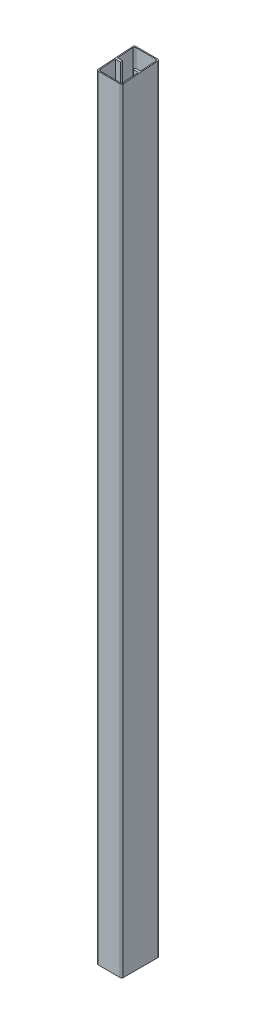
ISO-10303-21;
HEADER;
FILE_DESCRIPTION(('STEP AP214'),'2;1');
FILE_NAME('part.step','',(''),(''),'','','');
FILE_SCHEMA(('AUTOMOTIVE_DESIGN { 1 0 10303 214 1 1 1 1 }'));
ENDSEC;
DATA;
#1=APPLICATION_CONTEXT('core data for automotive mechanical design processes');
#2=APPLICATION_PROTOCOL_DEFINITION('international standard','automotive_design',2000,#1);
#3=PRODUCT_CONTEXT('',#1,'mechanical');
#4=PRODUCT('Part','Part','',(#3));
#5=PRODUCT_RELATED_PRODUCT_CATEGORY('part','',(#4));
#6=PRODUCT_DEFINITION_FORMATION('','',#4);
#7=PRODUCT_DEFINITION_CONTEXT('part definition',#1,'design');
#8=PRODUCT_DEFINITION('design','',#6,#7);
#9=PRODUCT_DEFINITION_SHAPE('','',#8);
#10=(LENGTH_UNIT() NAMED_UNIT(*) SI_UNIT(.MILLI.,.METRE.));
#11=(NAMED_UNIT(*) PLANE_ANGLE_UNIT() SI_UNIT($,.RADIAN.));
#12=(NAMED_UNIT(*) SI_UNIT($,.STERADIAN.) SOLID_ANGLE_UNIT());
#13=UNCERTAINTY_MEASURE_WITH_UNIT(LENGTH_MEASURE(1.E-05),#10,'distance_accuracy_value','');
#14=(GEOMETRIC_REPRESENTATION_CONTEXT(3) GLOBAL_UNCERTAINTY_ASSIGNED_CONTEXT((#13)) GLOBAL_UNIT_ASSIGNED_CONTEXT((#10,
#11,#12)) REPRESENTATION_CONTEXT('',''));
#15=CARTESIAN_POINT('',(0.,0.,0.));
#16=DIRECTION('',(0.,0.,1.));
#17=DIRECTION('',(1.,0.,0.));
#18=AXIS2_PLACEMENT_3D('',#15,#16,#17);
#19=CARTESIAN_POINT('',(-50.,3267.99923956295,75.));
#20=DIRECTION('',(0.,0.,-1.));
#21=DIRECTION('',(-1.,0.,0.));
#22=AXIS2_PLACEMENT_3D('',#19,#20,#21);
#23=PLANE('',#22);
#24=DIRECTION('',(1.,0.,0.));
#25=VECTOR('',#24,1.);
#26=CARTESIAN_POINT('',(-50.,0.,75.));
#27=LINE('',#26,#25);
#28=CARTESIAN_POINT('',(-44.,0.,75.));
#29=VERTEX_POINT('',#28);
#30=CARTESIAN_POINT('',(44.,0.,75.));
#31=VERTEX_POINT('',#30);
#32=EDGE_CURVE('E212',#29,#31,#27,.T.);
#33=ORIENTED_EDGE('',*,*,#32,.T.);
#34=DIRECTION('',(0.,-1.,0.));
#35=VECTOR('',#34,1.);
#36=CARTESIAN_POINT('',(44.,3267.99923956295,75.));
#37=LINE('',#36,#35);
#38=CARTESIAN_POINT('',(44.,3082.23684210526,75.));
#39=VERTEX_POINT('',#38);
#40=EDGE_CURVE('E288',#31,#39,#37,.F.);
#41=ORIENTED_EDGE('',*,*,#40,.T.);
#42=DIRECTION('',(1.,0.,0.));
#43=VECTOR('',#42,1.);
#44=CARTESIAN_POINT('',(-50.,3082.23684210526,75.));
#45=LINE('',#44,#43);
#46=CARTESIAN_POINT('',(-44.,3082.23684210526,75.));
#47=VERTEX_POINT('',#46);
#48=EDGE_CURVE('E345',#47,#39,#45,.T.);
#49=ORIENTED_EDGE('',*,*,#48,.F.);
#50=DIRECTION('',(0.,-1.,0.));
#51=VECTOR('',#50,1.);
#52=CARTESIAN_POINT('',(-44.,3267.99923956295,75.));
#53=LINE('',#52,#51);
#54=EDGE_CURVE('E285',#47,#29,#53,.T.);
#55=ORIENTED_EDGE('',*,*,#54,.T.);
#56=EDGE_LOOP('',(#33,#41,#49,#55));
#57=FACE_BOUND('',#56,.T.);
#58=ADVANCED_FACE('F38',(#57),#23,.F.);
#59=CARTESIAN_POINT('',(-50.,3267.99923956295,-75.));
#60=DIRECTION('',(1.,0.,0.));
#61=DIRECTION('',(0.,0.,-1.));
#62=AXIS2_PLACEMENT_3D('',#59,#60,#61);
#63=PLANE('',#62);
#64=DIRECTION('',(0.,-0.0700032814807309,0.997546761100416));
#65=VECTOR('',#64,1.);
#66=CARTESIAN_POINT('',(-50.,3093.62189520153,-87.2370066218541));
#67=LINE('',#66,#65);
#68=CARTESIAN_POINT('',(-50.,3092.34210526316,-68.9999999999999));
#69=VERTEX_POINT('',#68);
#70=CARTESIAN_POINT('',(-50.,3082.65789473684,69.));
#71=VERTEX_POINT('',#70);
#72=EDGE_CURVE('E347',#69,#71,#67,.T.);
#73=ORIENTED_EDGE('',*,*,#72,.F.);
#74=DIRECTION('',(0.,-1.,0.));
#75=VECTOR('',#74,1.);
#76=CARTESIAN_POINT('',(-50.,3267.99923956295,-69.));
#77=LINE('',#76,#75);
#78=CARTESIAN_POINT('',(-50.,0.,-69.));
#79=VERTEX_POINT('',#78);
#80=EDGE_CURVE('E258',#69,#79,#77,.T.);
#81=ORIENTED_EDGE('',*,*,#80,.T.);
#82=DIRECTION('',(0.,0.,1.));
#83=VECTOR('',#82,1.);
#84=CARTESIAN_POINT('',(-50.,0.,-75.));
#85=LINE('',#84,#83);
#86=CARTESIAN_POINT('',(-50.,0.,69.));
#87=VERTEX_POINT('',#86);
#88=EDGE_CURVE('E252',#79,#87,#85,.T.);
#89=ORIENTED_EDGE('',*,*,#88,.T.);
#90=DIRECTION('',(0.,-1.,0.));
#91=VECTOR('',#90,1.);
#92=CARTESIAN_POINT('',(-50.,3267.99923956295,69.));
#93=LINE('',#92,#91);
#94=EDGE_CURVE('E211',#87,#71,#93,.F.);
#95=ORIENTED_EDGE('',*,*,#94,.T.);
#96=EDGE_LOOP('',(#73,#81,#89,#95));
#97=FACE_BOUND('',#96,.T.);
#98=ADVANCED_FACE('F450',(#97),#63,.F.);
#99=CARTESIAN_POINT('',(-50.,3267.99923956295,-75.));
#100=DIRECTION('',(0.,0.,1.));
#101=DIRECTION('',(1.,0.,0.));
#102=AXIS2_PLACEMENT_3D('',#99,#100,#101);
#103=PLANE('',#102);
#104=DIRECTION('',(-1.,0.,0.));
#105=VECTOR('',#104,1.);
#106=CARTESIAN_POINT('',(-50.,0.,-75.));
#107=LINE('',#106,#105);
#108=CARTESIAN_POINT('',(44.,0.,-75.));
#109=VERTEX_POINT('',#108);
#110=CARTESIAN_POINT('',(-44.,0.,-75.));
#111=VERTEX_POINT('',#110);
#112=EDGE_CURVE('E249',#109,#111,#107,.T.);
#113=ORIENTED_EDGE('',*,*,#112,.T.);
#114=DIRECTION('',(0.,-1.,0.));
#115=VECTOR('',#114,1.);
#116=CARTESIAN_POINT('',(-44.,3267.99923956295,-75.));
#117=LINE('',#116,#115);
#118=CARTESIAN_POINT('',(-44.,3092.76315789474,-75.));
#119=VERTEX_POINT('',#118);
#120=EDGE_CURVE('E272',#111,#119,#117,.F.);
#121=ORIENTED_EDGE('',*,*,#120,.T.);
#122=DIRECTION('',(-1.,0.,0.));
#123=VECTOR('',#122,1.);
#124=CARTESIAN_POINT('',(-50.,3092.76315789474,-75.));
#125=LINE('',#124,#123);
#126=CARTESIAN_POINT('',(44.,3092.76315789474,-75.));
#127=VERTEX_POINT('',#126);
#128=EDGE_CURVE('E355',#127,#119,#125,.T.);
#129=ORIENTED_EDGE('',*,*,#128,.F.);
#130=DIRECTION('',(0.,-1.,0.));
#131=VECTOR('',#130,1.);
#132=CARTESIAN_POINT('',(44.,3267.99923956295,-75.));
#133=LINE('',#132,#131);
#134=EDGE_CURVE('E269',#127,#109,#133,.T.);
#135=ORIENTED_EDGE('',*,*,#134,.T.);
#136=EDGE_LOOP('',(#113,#121,#129,#135));
#137=FACE_BOUND('',#136,.T.);
#138=ADVANCED_FACE('F456',(#137),#103,.F.);
#139=CARTESIAN_POINT('',(50.,3267.99923956295,-75.));
#140=DIRECTION('',(-1.,0.,0.));
#141=DIRECTION('',(0.,0.,1.));
#142=AXIS2_PLACEMENT_3D('',#139,#140,#141);
#143=PLANE('',#142);
#144=DIRECTION('',(0.,0.0700032814807309,-0.997546761100416));
#145=VECTOR('',#144,1.);
#146=CARTESIAN_POINT('',(50.,3093.62189520153,-87.2370066218541));
#147=LINE('',#146,#145);
#148=CARTESIAN_POINT('',(50.,3082.65789473684,69.));
#149=VERTEX_POINT('',#148);
#150=CARTESIAN_POINT('',(50.,3092.34210526316,-68.9999999999999));
#151=VERTEX_POINT('',#150);
#152=EDGE_CURVE('E358',#149,#151,#147,.T.);
#153=ORIENTED_EDGE('',*,*,#152,.F.);
#154=DIRECTION('',(0.,-1.,0.));
#155=VECTOR('',#154,1.);
#156=CARTESIAN_POINT('',(50.,3267.99923956295,69.));
#157=LINE('',#156,#155);
#158=CARTESIAN_POINT('',(50.,0.,69.));
#159=VERTEX_POINT('',#158);
#160=EDGE_CURVE('E282',#149,#159,#157,.T.);
#161=ORIENTED_EDGE('',*,*,#160,.T.);
#162=DIRECTION('',(0.,0.,-1.));
#163=VECTOR('',#162,1.);
#164=CARTESIAN_POINT('',(50.,0.,-75.));
#165=LINE('',#164,#163);
#166=CARTESIAN_POINT('',(50.,0.,-69.));
#167=VERTEX_POINT('',#166);
#168=EDGE_CURVE('E247',#159,#167,#165,.T.);
#169=ORIENTED_EDGE('',*,*,#168,.T.);
#170=DIRECTION('',(0.,-1.,0.));
#171=VECTOR('',#170,1.);
#172=CARTESIAN_POINT('',(50.,3267.99923956295,-69.));
#173=LINE('',#172,#171);
#174=EDGE_CURVE('E53',#167,#151,#173,.F.);
#175=ORIENTED_EDGE('',*,*,#174,.T.);
#176=EDGE_LOOP('',(#153,#161,#169,#175));
#177=FACE_BOUND('',#176,.T.);
#178=ADVANCED_FACE('F464',(#177),#143,.F.);
#179=CARTESIAN_POINT('',(0.,0.,0.));
#180=DIRECTION('',(0.,1.,0.));
#181=DIRECTION('',(0.,0.,1.));
#182=AXIS2_PLACEMENT_3D('',#179,#180,#181);
#183=PLANE('',#182);
#184=ORIENTED_EDGE('',*,*,#88,.F.);
#185=CARTESIAN_POINT('',(-44.,0.,-69.));
#186=DIRECTION('',(0.,1.,0.));
#187=DIRECTION('',(0.,0.,1.));
#188=AXIS2_PLACEMENT_3D('',#185,#186,#187);
#189=CIRCLE('',#188,6.);
#190=EDGE_CURVE('E267',#79,#111,#189,.F.);
#191=ORIENTED_EDGE('',*,*,#190,.T.);
#192=ORIENTED_EDGE('',*,*,#112,.F.);
#193=CARTESIAN_POINT('',(44.,0.,-69.));
#194=DIRECTION('',(0.,1.,0.));
#195=DIRECTION('',(0.,0.,1.));
#196=AXIS2_PLACEMENT_3D('',#193,#194,#195);
#197=CIRCLE('',#196,6.);
#198=EDGE_CURVE('E263',#109,#167,#197,.F.);
#199=ORIENTED_EDGE('',*,*,#198,.T.);
#200=ORIENTED_EDGE('',*,*,#168,.F.);
#201=CARTESIAN_POINT('',(44.,0.,69.));
#202=DIRECTION('',(0.,1.,0.));
#203=DIRECTION('',(0.,0.,1.));
#204=AXIS2_PLACEMENT_3D('',#201,#202,#203);
#205=CIRCLE('',#204,6.);
#206=EDGE_CURVE('E265',#159,#31,#205,.F.);
#207=ORIENTED_EDGE('',*,*,#206,.T.);
#208=ORIENTED_EDGE('',*,*,#32,.F.);
#209=CARTESIAN_POINT('',(-44.,0.,69.));
#210=DIRECTION('',(0.,1.,0.));
#211=DIRECTION('',(0.,0.,1.));
#212=AXIS2_PLACEMENT_3D('',#209,#210,#211);
#213=CIRCLE('',#212,6.);
#214=EDGE_CURVE('E261',#29,#87,#213,.F.);
#215=ORIENTED_EDGE('',*,*,#214,.T.);
#216=EDGE_LOOP('',(#184,#191,#192,#199,#200,#207,#208,#215));
#217=FACE_BOUND('',#216,.T.);
#218=DIRECTION('',(0.,0.,-1.));
#219=VECTOR('',#218,1.);
#220=CARTESIAN_POINT('',(46.,0.,-71.));
#221=LINE('',#220,#219);
#222=CARTESIAN_POINT('',(46.,0.,-4.00000000000001));
#223=VERTEX_POINT('',#222);
#224=CARTESIAN_POINT('',(46.,0.,-65.));
#225=VERTEX_POINT('',#224);
#226=EDGE_CURVE('E225',#223,#225,#221,.T.);
#227=ORIENTED_EDGE('',*,*,#226,.T.);
#228=CARTESIAN_POINT('',(40.,0.,-65.));
#229=DIRECTION('',(0.,1.,0.));
#230=DIRECTION('',(0.,0.,1.));
#231=AXIS2_PLACEMENT_3D('',#228,#229,#230);
#232=CIRCLE('',#231,6.);
#233=CARTESIAN_POINT('',(40.,0.,-71.));
#234=VERTEX_POINT('',#233);
#235=EDGE_CURVE('E317',#225,#234,#232,.T.);
#236=ORIENTED_EDGE('',*,*,#235,.T.);
#237=DIRECTION('',(-1.,0.,0.));
#238=VECTOR('',#237,1.);
#239=CARTESIAN_POINT('',(-46.,0.,-71.));
#240=LINE('',#239,#238);
#241=CARTESIAN_POINT('',(-40.,0.,-71.));
#242=VERTEX_POINT('',#241);
#243=EDGE_CURVE('E326',#234,#242,#240,.T.);
#244=ORIENTED_EDGE('',*,*,#243,.T.);
#245=CARTESIAN_POINT('',(-40.,0.,-65.));
#246=DIRECTION('',(0.,1.,0.));
#247=DIRECTION('',(0.,0.,1.));
#248=AXIS2_PLACEMENT_3D('',#245,#246,#247);
#249=CIRCLE('',#248,6.);
#250=CARTESIAN_POINT('',(-46.,0.,-65.));
#251=VERTEX_POINT('',#250);
#252=EDGE_CURVE('E46',#242,#251,#249,.T.);
#253=ORIENTED_EDGE('',*,*,#252,.T.);
#254=DIRECTION('',(0.,0.,1.));
#255=VECTOR('',#254,1.);
#256=CARTESIAN_POINT('',(-46.,0.,-71.));
#257=LINE('',#256,#255);
#258=CARTESIAN_POINT('',(-46.,0.,-4.));
#259=VERTEX_POINT('',#258);
#260=EDGE_CURVE('E324',#251,#259,#257,.T.);
#261=ORIENTED_EDGE('',*,*,#260,.T.);
#262=DIRECTION('',(1.,0.,0.));
#263=VECTOR('',#262,1.);
#264=CARTESIAN_POINT('',(-46.,0.,-4.));
#265=LINE('',#264,#263);
#266=CARTESIAN_POINT('',(-26.,0.,-4.));
#267=VERTEX_POINT('',#266);
#268=EDGE_CURVE('E335',#259,#267,#265,.T.);
#269=ORIENTED_EDGE('',*,*,#268,.T.);
#270=DIRECTION('',(0.,0.,1.));
#271=VECTOR('',#270,1.);
#272=CARTESIAN_POINT('',(-26.,0.,-4.));
#273=LINE('',#272,#271);
#274=CARTESIAN_POINT('',(-26.,0.,4.));
#275=VERTEX_POINT('',#274);
#276=EDGE_CURVE('E362',#267,#275,#273,.T.);
#277=ORIENTED_EDGE('',*,*,#276,.T.);
#278=DIRECTION('',(-1.,0.,0.));
#279=VECTOR('',#278,1.);
#280=CARTESIAN_POINT('',(-46.,0.,4.));
#281=LINE('',#280,#279);
#282=CARTESIAN_POINT('',(-46.,0.,4.));
#283=VERTEX_POINT('',#282);
#284=EDGE_CURVE('E365',#275,#283,#281,.T.);
#285=ORIENTED_EDGE('',*,*,#284,.T.);
#286=DIRECTION('',(0.,0.,1.));
#287=VECTOR('',#286,1.);
#288=CARTESIAN_POINT('',(-46.,0.,4.));
#289=LINE('',#288,#287);
#290=CARTESIAN_POINT('',(-46.,0.,65.));
#291=VERTEX_POINT('',#290);
#292=EDGE_CURVE('E368',#283,#291,#289,.T.);
#293=ORIENTED_EDGE('',*,*,#292,.T.);
#294=CARTESIAN_POINT('',(-40.,0.,65.));
#295=DIRECTION('',(0.,1.,0.));
#296=DIRECTION('',(0.,0.,1.));
#297=AXIS2_PLACEMENT_3D('',#294,#295,#296);
#298=CIRCLE('',#297,6.);
#299=CARTESIAN_POINT('',(-40.,0.,71.));
#300=VERTEX_POINT('',#299);
#301=EDGE_CURVE('E313',#291,#300,#298,.T.);
#302=ORIENTED_EDGE('',*,*,#301,.T.);
#303=DIRECTION('',(1.,0.,0.));
#304=VECTOR('',#303,1.);
#305=CARTESIAN_POINT('',(-46.,0.,71.));
#306=LINE('',#305,#304);
#307=CARTESIAN_POINT('',(40.0000000000001,0.,71.));
#308=VERTEX_POINT('',#307);
#309=EDGE_CURVE('E371',#300,#308,#306,.T.);
#310=ORIENTED_EDGE('',*,*,#309,.T.);
#311=CARTESIAN_POINT('',(40.0000000000001,0.,65.));
#312=DIRECTION('',(0.,1.,0.));
#313=DIRECTION('',(0.,0.,1.));
#314=AXIS2_PLACEMENT_3D('',#311,#312,#313);
#315=CIRCLE('',#314,6.);
#316=CARTESIAN_POINT('',(46.,0.,65.));
#317=VERTEX_POINT('',#316);
#318=EDGE_CURVE('E309',#308,#317,#315,.T.);
#319=ORIENTED_EDGE('',*,*,#318,.T.);
#320=DIRECTION('',(0.,0.,-1.));
#321=VECTOR('',#320,1.);
#322=CARTESIAN_POINT('',(46.,0.,3.99999999999999));
#323=LINE('',#322,#321);
#324=CARTESIAN_POINT('',(46.,0.,3.99999999999999));
#325=VERTEX_POINT('',#324);
#326=EDGE_CURVE('E374',#317,#325,#323,.T.);
#327=ORIENTED_EDGE('',*,*,#326,.T.);
#328=DIRECTION('',(-1.,0.,0.));
#329=VECTOR('',#328,1.);
#330=CARTESIAN_POINT('',(46.,0.,3.99999999999999));
#331=LINE('',#330,#329);
#332=CARTESIAN_POINT('',(26.,0.,4.));
#333=VERTEX_POINT('',#332);
#334=EDGE_CURVE('E376',#325,#333,#331,.T.);
#335=ORIENTED_EDGE('',*,*,#334,.T.);
#336=DIRECTION('',(0.,0.,-1.));
#337=VECTOR('',#336,1.);
#338=CARTESIAN_POINT('',(26.,0.,-4.));
#339=LINE('',#338,#337);
#340=CARTESIAN_POINT('',(26.,0.,-4.));
#341=VERTEX_POINT('',#340);
#342=EDGE_CURVE('E379',#333,#341,#339,.T.);
#343=ORIENTED_EDGE('',*,*,#342,.T.);
#344=DIRECTION('',(1.,0.,0.));
#345=VECTOR('',#344,1.);
#346=CARTESIAN_POINT('',(46.,0.,-4.00000000000001));
#347=LINE('',#346,#345);
#348=EDGE_CURVE('E230',#341,#223,#347,.T.);
#349=ORIENTED_EDGE('',*,*,#348,.T.);
#350=EDGE_LOOP('',(#227,#236,#244,#253,#261,#269,#277,#285,#293,#302,#310,#319,#327,#335,#343,#349));
#351=FACE_BOUND('',#350,.T.);
#352=ADVANCED_FACE('F322',(#217,#351),#183,.F.);
#353=CARTESIAN_POINT('',(46.,3267.99923956295,-71.));
#354=DIRECTION('',(-1.,0.,0.));
#355=DIRECTION('',(0.,0.,1.));
#356=AXIS2_PLACEMENT_3D('',#353,#354,#355);
#357=PLANE('',#356);
#358=DIRECTION('',(0.,0.0700032814807309,-0.997546761100416));
#359=VECTOR('',#358,1.);
#360=CARTESIAN_POINT('',(46.,3093.3425690147,-83.2566084595264));
#361=LINE('',#360,#359);
#362=CARTESIAN_POINT('',(46.,3087.78070175439,-3.99999999999999));
#363=VERTEX_POINT('',#362);
#364=CARTESIAN_POINT('',(46.,3092.06140350877,-65.));
#365=VERTEX_POINT('',#364);
#366=EDGE_CURVE('E199',#363,#365,#361,.T.);
#367=ORIENTED_EDGE('',*,*,#366,.T.);
#368=DIRECTION('',(0.,-1.,0.));
#369=VECTOR('',#368,1.);
#370=CARTESIAN_POINT('',(46.,0.,-65.));
#371=LINE('',#370,#369);
#372=EDGE_CURVE('E300',#365,#225,#371,.T.);
#373=ORIENTED_EDGE('',*,*,#372,.T.);
#374=ORIENTED_EDGE('',*,*,#226,.F.);
#375=DIRECTION('',(0.,-1.,0.));
#376=VECTOR('',#375,1.);
#377=CARTESIAN_POINT('',(46.,3267.99923956295,-4.00000000000001));
#378=LINE('',#377,#376);
#379=EDGE_CURVE('E217',#363,#223,#378,.T.);
#380=ORIENTED_EDGE('',*,*,#379,.F.);
#381=EDGE_LOOP('',(#367,#373,#374,#380));
#382=FACE_BOUND('',#381,.T.);
#383=ADVANCED_FACE('F223',(#382),#357,.T.);
#384=CARTESIAN_POINT('',(46.,3267.99923956295,-4.00000000000001));
#385=DIRECTION('',(0.,0.,-1.));
#386=DIRECTION('',(-1.,0.,0.));
#387=AXIS2_PLACEMENT_3D('',#384,#385,#386);
#388=PLANE('',#387);
#389=DIRECTION('',(0.,-1.,0.));
#390=VECTOR('',#389,1.);
#391=CARTESIAN_POINT('',(26.,3267.99923956295,-4.));
#392=LINE('',#391,#390);
#393=CARTESIAN_POINT('',(26.,3087.78070175439,-4.));
#394=VERTEX_POINT('',#393);
#395=EDGE_CURVE('E219',#394,#341,#392,.T.);
#396=ORIENTED_EDGE('',*,*,#395,.F.);
#397=DIRECTION('',(1.,0.,0.));
#398=VECTOR('',#397,1.);
#399=CARTESIAN_POINT('',(46.,3087.78070175439,-4.00000000000001));
#400=LINE('',#399,#398);
#401=EDGE_CURVE('E203',#394,#363,#400,.T.);
#402=ORIENTED_EDGE('',*,*,#401,.T.);
#403=ORIENTED_EDGE('',*,*,#379,.T.);
#404=ORIENTED_EDGE('',*,*,#348,.F.);
#405=EDGE_LOOP('',(#396,#402,#403,#404));
#406=FACE_BOUND('',#405,.T.);
#407=ADVANCED_FACE('F215',(#406),#388,.T.);
#408=CARTESIAN_POINT('',(26.,3267.99923956295,-4.));
#409=DIRECTION('',(-1.,0.,0.));
#410=DIRECTION('',(0.,0.,1.));
#411=AXIS2_PLACEMENT_3D('',#408,#409,#410);
#412=PLANE('',#411);
#413=DIRECTION('',(0.,-1.,0.));
#414=VECTOR('',#413,1.);
#415=CARTESIAN_POINT('',(26.,3267.99923956295,4.));
#416=LINE('',#415,#414);
#417=CARTESIAN_POINT('',(26.,3087.21929824561,4.));
#418=VERTEX_POINT('',#417);
#419=EDGE_CURVE('E228',#418,#333,#416,.T.);
#420=ORIENTED_EDGE('',*,*,#419,.F.);
#421=DIRECTION('',(0.,0.0700032814807309,-0.997546761100416));
#422=VECTOR('',#421,1.);
#423=CARTESIAN_POINT('',(26.,3088.6638553853,-16.5849392405371));
#424=LINE('',#423,#422);
#425=EDGE_CURVE('E221',#418,#394,#424,.T.);
#426=ORIENTED_EDGE('',*,*,#425,.T.);
#427=ORIENTED_EDGE('',*,*,#395,.T.);
#428=ORIENTED_EDGE('',*,*,#342,.F.);
#429=EDGE_LOOP('',(#420,#426,#427,#428));
#430=FACE_BOUND('',#429,.T.);
#431=ADVANCED_FACE('F385',(#430),#412,.T.);
#432=CARTESIAN_POINT('',(46.,3267.99923956295,3.99999999999999));
#433=DIRECTION('',(0.,0.,1.));
#434=DIRECTION('',(1.,0.,0.));
#435=AXIS2_PLACEMENT_3D('',#432,#433,#434);
#436=PLANE('',#435);
#437=DIRECTION('',(0.,-1.,0.));
#438=VECTOR('',#437,1.);
#439=CARTESIAN_POINT('',(46.,3267.99923956295,3.99999999999999));
#440=LINE('',#439,#438);
#441=CARTESIAN_POINT('',(46.,3087.21929824561,3.99999999999999));
#442=VERTEX_POINT('',#441);
#443=EDGE_CURVE('E235',#442,#325,#440,.T.);
#444=ORIENTED_EDGE('',*,*,#443,.F.);
#445=DIRECTION('',(-1.,0.,0.));
#446=VECTOR('',#445,1.);
#447=CARTESIAN_POINT('',(46.,3087.21929824561,3.99999999999999));
#448=LINE('',#447,#446);
#449=EDGE_CURVE('E388',#442,#418,#448,.T.);
#450=ORIENTED_EDGE('',*,*,#449,.T.);
#451=ORIENTED_EDGE('',*,*,#419,.T.);
#452=ORIENTED_EDGE('',*,*,#334,.F.);
#453=EDGE_LOOP('',(#444,#450,#451,#452));
#454=FACE_BOUND('',#453,.T.);
#455=ADVANCED_FACE('F440',(#454),#436,.T.);
#456=CARTESIAN_POINT('',(46.,3267.99923956295,3.99999999999999));
#457=DIRECTION('',(-1.,0.,0.));
#458=DIRECTION('',(0.,0.,1.));
#459=AXIS2_PLACEMENT_3D('',#456,#457,#458);
#460=PLANE('',#459);
#461=ORIENTED_EDGE('',*,*,#326,.F.);
#462=DIRECTION('',(0.,-1.,0.));
#463=VECTOR('',#462,1.);
#464=CARTESIAN_POINT('',(46.,3082.51754385965,65.));
#465=LINE('',#464,#463);
#466=CARTESIAN_POINT('',(46.,3082.93859649123,65.));
#467=VERTEX_POINT('',#466);
#468=EDGE_CURVE('E295',#317,#467,#465,.F.);
#469=ORIENTED_EDGE('',*,*,#468,.T.);
#470=DIRECTION('',(0.,0.0700032814807309,-0.997546761100416));
#471=VECTOR('',#470,1.);
#472=CARTESIAN_POINT('',(46.,3088.10520301164,-8.62414291588171));
#473=LINE('',#472,#471);
#474=EDGE_CURVE('E390',#467,#442,#473,.T.);
#475=ORIENTED_EDGE('',*,*,#474,.T.);
#476=ORIENTED_EDGE('',*,*,#443,.T.);
#477=EDGE_LOOP('',(#461,#469,#475,#476));
#478=FACE_BOUND('',#477,.T.);
#479=ADVANCED_FACE('F436',(#478),#460,.T.);
#480=CARTESIAN_POINT('',(-46.,3267.99923956295,71.));
#481=DIRECTION('',(0.,0.,-1.));
#482=DIRECTION('',(-1.,0.,0.));
#483=AXIS2_PLACEMENT_3D('',#480,#481,#482);
#484=PLANE('',#483);
#485=DIRECTION('',(1.,0.,0.));
#486=VECTOR('',#485,1.);
#487=CARTESIAN_POINT('',(-46.,3082.51754385965,71.));
#488=LINE('',#487,#486);
#489=CARTESIAN_POINT('',(-40.,3082.51754385965,71.));
#490=VERTEX_POINT('',#489);
#491=CARTESIAN_POINT('',(40.0000000000001,3082.51754385965,71.));
#492=VERTEX_POINT('',#491);
#493=EDGE_CURVE('E394',#490,#492,#488,.T.);
#494=ORIENTED_EDGE('',*,*,#493,.T.);
#495=DIRECTION('',(0.,-1.,0.));
#496=VECTOR('',#495,1.);
#497=CARTESIAN_POINT('',(40.0000000000001,0.,71.));
#498=LINE('',#497,#496);
#499=EDGE_CURVE('E292',#492,#308,#498,.T.);
#500=ORIENTED_EDGE('',*,*,#499,.T.);
#501=ORIENTED_EDGE('',*,*,#309,.F.);
#502=DIRECTION('',(0.,-1.,0.));
#503=VECTOR('',#502,1.);
#504=CARTESIAN_POINT('',(-40.,3082.51754385965,71.));
#505=LINE('',#504,#503);
#506=EDGE_CURVE('E290',#300,#490,#505,.F.);
#507=ORIENTED_EDGE('',*,*,#506,.T.);
#508=EDGE_LOOP('',(#494,#500,#501,#507));
#509=FACE_BOUND('',#508,.T.);
#510=ADVANCED_FACE('F427',(#509),#484,.T.);
#511=CARTESIAN_POINT('',(-46.,3267.99923956295,4.));
#512=DIRECTION('',(1.,0.,0.));
#513=DIRECTION('',(0.,0.,-1.));
#514=AXIS2_PLACEMENT_3D('',#511,#512,#513);
#515=PLANE('',#514);
#516=DIRECTION('',(0.,-0.0700032814807309,0.997546761100416));
#517=VECTOR('',#516,1.);
#518=CARTESIAN_POINT('',(-46.,3088.10520301164,-8.6241429158817));
#519=LINE('',#518,#517);
#520=CARTESIAN_POINT('',(-46.,3087.21929824561,4.));
#521=VERTEX_POINT('',#520);
#522=CARTESIAN_POINT('',(-46.,3082.93859649123,65.));
#523=VERTEX_POINT('',#522);
#524=EDGE_CURVE('E397',#521,#523,#519,.T.);
#525=ORIENTED_EDGE('',*,*,#524,.T.);
#526=DIRECTION('',(0.,-1.,0.));
#527=VECTOR('',#526,1.);
#528=CARTESIAN_POINT('',(-46.,0.,65.));
#529=LINE('',#528,#527);
#530=EDGE_CURVE('E297',#523,#291,#529,.T.);
#531=ORIENTED_EDGE('',*,*,#530,.T.);
#532=ORIENTED_EDGE('',*,*,#292,.F.);
#533=DIRECTION('',(0.,-1.,0.));
#534=VECTOR('',#533,1.);
#535=CARTESIAN_POINT('',(-46.,3267.99923956295,4.));
#536=LINE('',#535,#534);
#537=EDGE_CURVE('E238',#521,#283,#536,.T.);
#538=ORIENTED_EDGE('',*,*,#537,.F.);
#539=EDGE_LOOP('',(#525,#531,#532,#538));
#540=FACE_BOUND('',#539,.T.);
#541=ADVANCED_FACE('F419',(#540),#515,.T.);
#542=CARTESIAN_POINT('',(-46.,3267.99923956295,4.));
#543=DIRECTION('',(0.,0.,1.));
#544=DIRECTION('',(1.,0.,0.));
#545=AXIS2_PLACEMENT_3D('',#542,#543,#544);
#546=PLANE('',#545);
#547=DIRECTION('',(0.,-1.,0.));
#548=VECTOR('',#547,1.);
#549=CARTESIAN_POINT('',(-26.,3267.99923956295,4.));
#550=LINE('',#549,#548);
#551=CARTESIAN_POINT('',(-26.,3087.21929824561,4.));
#552=VERTEX_POINT('',#551);
#553=EDGE_CURVE('E240',#552,#275,#550,.T.);
#554=ORIENTED_EDGE('',*,*,#553,.F.);
#555=DIRECTION('',(-1.,0.,0.));
#556=VECTOR('',#555,1.);
#557=CARTESIAN_POINT('',(-46.,3087.21929824561,4.));
#558=LINE('',#557,#556);
#559=EDGE_CURVE('E400',#552,#521,#558,.T.);
#560=ORIENTED_EDGE('',*,*,#559,.T.);
#561=ORIENTED_EDGE('',*,*,#537,.T.);
#562=ORIENTED_EDGE('',*,*,#284,.F.);
#563=EDGE_LOOP('',(#554,#560,#561,#562));
#564=FACE_BOUND('',#563,.T.);
#565=ADVANCED_FACE('F416',(#564),#546,.T.);
#566=CARTESIAN_POINT('',(-26.,3267.99923956295,-4.));
#567=DIRECTION('',(1.,0.,0.));
#568=DIRECTION('',(0.,0.,-1.));
#569=AXIS2_PLACEMENT_3D('',#566,#567,#568);
#570=PLANE('',#569);
#571=DIRECTION('',(0.,-1.,0.));
#572=VECTOR('',#571,1.);
#573=CARTESIAN_POINT('',(-26.,3267.99923956295,-4.));
#574=LINE('',#573,#572);
#575=CARTESIAN_POINT('',(-26.,3087.78070175439,-4.));
#576=VERTEX_POINT('',#575);
#577=EDGE_CURVE('E242',#576,#267,#574,.T.);
#578=ORIENTED_EDGE('',*,*,#577,.F.);
#579=DIRECTION('',(0.,-0.0700032814807309,0.997546761100416));
#580=VECTOR('',#579,1.);
#581=CARTESIAN_POINT('',(-26.,3088.6638553853,-16.5849392405371));
#582=LINE('',#581,#580);
#583=EDGE_CURVE('E403',#576,#552,#582,.T.);
#584=ORIENTED_EDGE('',*,*,#583,.T.);
#585=ORIENTED_EDGE('',*,*,#553,.T.);
#586=ORIENTED_EDGE('',*,*,#276,.F.);
#587=EDGE_LOOP('',(#578,#584,#585,#586));
#588=FACE_BOUND('',#587,.T.);
#589=ADVANCED_FACE('F412',(#588),#570,.T.);
#590=CARTESIAN_POINT('',(-46.,3267.99923956295,-4.));
#591=DIRECTION('',(0.,0.,-1.));
#592=DIRECTION('',(-1.,0.,0.));
#593=AXIS2_PLACEMENT_3D('',#590,#591,#592);
#594=PLANE('',#593);
#595=DIRECTION('',(0.,-1.,0.));
#596=VECTOR('',#595,1.);
#597=CARTESIAN_POINT('',(-46.,3267.99923956295,-4.));
#598=LINE('',#597,#596);
#599=CARTESIAN_POINT('',(-46.,3087.78070175439,-4.));
#600=VERTEX_POINT('',#599);
#601=EDGE_CURVE('E244',#600,#259,#598,.T.);
#602=ORIENTED_EDGE('',*,*,#601,.F.);
#603=DIRECTION('',(1.,0.,0.));
#604=VECTOR('',#603,1.);
#605=CARTESIAN_POINT('',(-46.,3087.78070175439,-4.));
#606=LINE('',#605,#604);
#607=EDGE_CURVE('E349',#600,#576,#606,.T.);
#608=ORIENTED_EDGE('',*,*,#607,.T.);
#609=ORIENTED_EDGE('',*,*,#577,.T.);
#610=ORIENTED_EDGE('',*,*,#268,.F.);
#611=EDGE_LOOP('',(#602,#608,#609,#610));
#612=FACE_BOUND('',#611,.T.);
#613=ADVANCED_FACE('F407',(#612),#594,.T.);
#614=CARTESIAN_POINT('',(-46.,3267.99923956295,-71.));
#615=DIRECTION('',(1.,0.,0.));
#616=DIRECTION('',(0.,0.,-1.));
#617=AXIS2_PLACEMENT_3D('',#614,#615,#616);
#618=PLANE('',#617);
#619=ORIENTED_EDGE('',*,*,#260,.F.);
#620=DIRECTION('',(0.,-1.,0.));
#621=VECTOR('',#620,1.);
#622=CARTESIAN_POINT('',(-46.,3092.48245614035,-65.));
#623=LINE('',#622,#621);
#624=CARTESIAN_POINT('',(-46.,3092.06140350877,-65.));
#625=VERTEX_POINT('',#624);
#626=EDGE_CURVE('E307',#251,#625,#623,.F.);
#627=ORIENTED_EDGE('',*,*,#626,.T.);
#628=DIRECTION('',(0.,-0.0700032814807309,0.997546761100416));
#629=VECTOR('',#628,1.);
#630=CARTESIAN_POINT('',(-46.,3093.3425690147,-83.2566084595264));
#631=LINE('',#630,#629);
#632=EDGE_CURVE('E341',#625,#600,#631,.T.);
#633=ORIENTED_EDGE('',*,*,#632,.T.);
#634=ORIENTED_EDGE('',*,*,#601,.T.);
#635=EDGE_LOOP('',(#619,#627,#633,#634));
#636=FACE_BOUND('',#635,.T.);
#637=ADVANCED_FACE('F331',(#636),#618,.T.);
#638=CARTESIAN_POINT('',(-46.,3267.99923956295,-71.));
#639=DIRECTION('',(0.,0.,1.));
#640=DIRECTION('',(1.,0.,0.));
#641=AXIS2_PLACEMENT_3D('',#638,#639,#640);
#642=PLANE('',#641);
#643=ORIENTED_EDGE('',*,*,#243,.F.);
#644=DIRECTION('',(0.,-1.,0.));
#645=VECTOR('',#644,1.);
#646=CARTESIAN_POINT('',(40.,3092.48245614035,-71.));
#647=LINE('',#646,#645);
#648=CARTESIAN_POINT('',(40.,3092.48245614035,-71.));
#649=VERTEX_POINT('',#648);
#650=EDGE_CURVE('E305',#234,#649,#647,.F.);
#651=ORIENTED_EDGE('',*,*,#650,.T.);
#652=DIRECTION('',(-1.,0.,0.));
#653=VECTOR('',#652,1.);
#654=CARTESIAN_POINT('',(-46.,3092.48245614035,-71.));
#655=LINE('',#654,#653);
#656=CARTESIAN_POINT('',(-40.,3092.48245614035,-71.));
#657=VERTEX_POINT('',#656);
#658=EDGE_CURVE('E339',#649,#657,#655,.T.);
#659=ORIENTED_EDGE('',*,*,#658,.T.);
#660=DIRECTION('',(0.,-1.,0.));
#661=VECTOR('',#660,1.);
#662=CARTESIAN_POINT('',(-40.,0.,-71.));
#663=LINE('',#662,#661);
#664=EDGE_CURVE('E302',#657,#242,#663,.T.);
#665=ORIENTED_EDGE('',*,*,#664,.T.);
#666=EDGE_LOOP('',(#643,#651,#659,#665));
#667=FACE_BOUND('',#666,.T.);
#668=ADVANCED_FACE('F343',(#667),#642,.T.);
#669=CARTESIAN_POINT('',(50.0000000000008,2677.49015555781,5842.64028330125));
#670=DIRECTION('',(0.,0.997546761100416,0.0700032814807309));
#671=DIRECTION('',(-1.,0.,0.));
#672=AXIS2_PLACEMENT_3D('',#669,#670,#671);
#673=PLANE('',#672);
#674=ORIENTED_EDGE('',*,*,#658,.F.);
#675=CARTESIAN_POINT('',(40.,3092.06140350877,-65.));
#676=DIRECTION('',(0.,0.997546761100416,0.0700032814807309));
#677=DIRECTION('',(0.,0.0700032814807309,-0.997546761100416));
#678=AXIS2_PLACEMENT_3D('',#675,#676,#677);
#679=ELLIPSE('',#678,6.01475563248912,6.);
#680=EDGE_CURVE('E206',#649,#365,#679,.F.);
#681=ORIENTED_EDGE('',*,*,#680,.T.);
#682=ORIENTED_EDGE('',*,*,#366,.F.);
#683=ORIENTED_EDGE('',*,*,#401,.F.);
#684=ORIENTED_EDGE('',*,*,#425,.F.);
#685=ORIENTED_EDGE('',*,*,#449,.F.);
#686=ORIENTED_EDGE('',*,*,#474,.F.);
#687=CARTESIAN_POINT('',(40.0000000000001,3082.93859649123,65.));
#688=DIRECTION('',(0.,0.997546761100416,0.0700032814807309));
#689=DIRECTION('',(0.,0.0700032814807309,-0.997546761100416));
#690=AXIS2_PLACEMENT_3D('',#687,#688,#689);
#691=ELLIPSE('',#690,6.01475563248912,6.);
#692=EDGE_CURVE('E311',#467,#492,#691,.F.);
#693=ORIENTED_EDGE('',*,*,#692,.T.);
#694=ORIENTED_EDGE('',*,*,#493,.F.);
#695=CARTESIAN_POINT('',(-40.,3082.93859649123,65.));
#696=DIRECTION('',(0.,0.997546761100416,0.0700032814807309));
#697=DIRECTION('',(0.,0.0700032814807309,-0.997546761100416));
#698=AXIS2_PLACEMENT_3D('',#695,#696,#697);
#699=ELLIPSE('',#698,6.01475563248912,6.);
#700=EDGE_CURVE('E315',#490,#523,#699,.F.);
#701=ORIENTED_EDGE('',*,*,#700,.T.);
#702=ORIENTED_EDGE('',*,*,#524,.F.);
#703=ORIENTED_EDGE('',*,*,#559,.F.);
#704=ORIENTED_EDGE('',*,*,#583,.F.);
#705=ORIENTED_EDGE('',*,*,#607,.F.);
#706=ORIENTED_EDGE('',*,*,#632,.F.);
#707=CARTESIAN_POINT('',(-40.,3092.06140350877,-65.));
#708=DIRECTION('',(0.,0.997546761100416,0.0700032814807309));
#709=DIRECTION('',(0.,0.0700032814807309,-0.997546761100416));
#710=AXIS2_PLACEMENT_3D('',#707,#708,#709);
#711=ELLIPSE('',#710,6.01475563248912,6.);
#712=EDGE_CURVE('E11',#625,#657,#711,.F.);
#713=ORIENTED_EDGE('',*,*,#712,.T.);
#714=EDGE_LOOP('',(#674,#681,#682,#683,#684,#685,#686,#693,#694,#701,#702,#703,#704,#705,#706,#713));
#715=FACE_BOUND('',#714,.T.);
#716=ORIENTED_EDGE('',*,*,#128,.T.);
#717=CARTESIAN_POINT('',(-44.,3092.34210526316,-69.));
#718=DIRECTION('',(0.,0.997546761100416,0.0700032814807309));
#719=DIRECTION('',(0.,-0.0700032814807309,0.997546761100416));
#720=AXIS2_PLACEMENT_3D('',#717,#718,#719);
#721=ELLIPSE('',#720,6.01475563248912,6.);
#722=EDGE_CURVE('E279',#119,#69,#721,.T.);
#723=ORIENTED_EDGE('',*,*,#722,.T.);
#724=ORIENTED_EDGE('',*,*,#72,.T.);
#725=CARTESIAN_POINT('',(-44.,3082.65789473684,69.));
#726=DIRECTION('',(0.,0.997546761100416,0.0700032814807309));
#727=DIRECTION('',(0.,-0.0700032814807309,0.997546761100416));
#728=AXIS2_PLACEMENT_3D('',#725,#726,#727);
#729=ELLIPSE('',#728,6.01475563248912,6.);
#730=EDGE_CURVE('E274',#71,#47,#729,.T.);
#731=ORIENTED_EDGE('',*,*,#730,.T.);
#732=ORIENTED_EDGE('',*,*,#48,.T.);
#733=CARTESIAN_POINT('',(44.,3082.65789473684,69.));
#734=DIRECTION('',(0.,0.997546761100416,0.0700032814807309));
#735=DIRECTION('',(0.,-0.0700032814807309,0.997546761100416));
#736=AXIS2_PLACEMENT_3D('',#733,#734,#735);
#737=ELLIPSE('',#736,6.01475563248912,6.);
#738=EDGE_CURVE('E60',#39,#149,#737,.T.);
#739=ORIENTED_EDGE('',*,*,#738,.T.);
#740=ORIENTED_EDGE('',*,*,#152,.T.);
#741=CARTESIAN_POINT('',(44.,3092.34210526316,-69.));
#742=DIRECTION('',(0.,0.997546761100416,0.0700032814807309));
#743=DIRECTION('',(0.,-0.0700032814807309,0.997546761100416));
#744=AXIS2_PLACEMENT_3D('',#741,#742,#743);
#745=ELLIPSE('',#744,6.01475563248912,6.);
#746=EDGE_CURVE('E276',#151,#127,#745,.T.);
#747=ORIENTED_EDGE('',*,*,#746,.T.);
#748=EDGE_LOOP('',(#716,#723,#724,#731,#732,#739,#740,#747));
#749=FACE_BOUND('',#748,.T.);
#750=ADVANCED_FACE('F202',(#715,#749),#673,.T.);
#751=CARTESIAN_POINT('',(-44.,3267.99923956295,-69.));
#752=DIRECTION('',(0.,-1.,0.));
#753=DIRECTION('',(0.,0.,-1.));
#754=AXIS2_PLACEMENT_3D('',#751,#752,#753);
#755=CYLINDRICAL_SURFACE('',#754,6.);
#756=ORIENTED_EDGE('',*,*,#722,.F.);
#757=ORIENTED_EDGE('',*,*,#120,.F.);
#758=ORIENTED_EDGE('',*,*,#190,.F.);
#759=ORIENTED_EDGE('',*,*,#80,.F.);
#760=EDGE_LOOP('',(#756,#757,#758,#759));
#761=FACE_BOUND('',#760,.T.);
#762=ADVANCED_FACE('F468',(#761),#755,.T.);
#763=CARTESIAN_POINT('',(44.,3267.99923956295,69.));
#764=DIRECTION('',(0.,-1.,0.));
#765=DIRECTION('',(0.,0.,-1.));
#766=AXIS2_PLACEMENT_3D('',#763,#764,#765);
#767=CYLINDRICAL_SURFACE('',#766,6.);
#768=ORIENTED_EDGE('',*,*,#738,.F.);
#769=ORIENTED_EDGE('',*,*,#40,.F.);
#770=ORIENTED_EDGE('',*,*,#206,.F.);
#771=ORIENTED_EDGE('',*,*,#160,.F.);
#772=EDGE_LOOP('',(#768,#769,#770,#771));
#773=FACE_BOUND('',#772,.T.);
#774=ADVANCED_FACE('F471',(#773),#767,.T.);
#775=CARTESIAN_POINT('',(40.0000000000001,3267.99923956295,65.));
#776=DIRECTION('',(0.,1.,0.));
#777=DIRECTION('',(0.,0.,1.));
#778=AXIS2_PLACEMENT_3D('',#775,#776,#777);
#779=CYLINDRICAL_SURFACE('',#778,6.);
#780=ORIENTED_EDGE('',*,*,#692,.F.);
#781=ORIENTED_EDGE('',*,*,#468,.F.);
#782=ORIENTED_EDGE('',*,*,#318,.F.);
#783=ORIENTED_EDGE('',*,*,#499,.F.);
#784=EDGE_LOOP('',(#780,#781,#782,#783));
#785=FACE_BOUND('',#784,.T.);
#786=ADVANCED_FACE('F432',(#785),#779,.F.);
#787=CARTESIAN_POINT('',(-40.,3267.99923956295,65.));
#788=DIRECTION('',(0.,1.,0.));
#789=DIRECTION('',(0.,0.,1.));
#790=AXIS2_PLACEMENT_3D('',#787,#788,#789);
#791=CYLINDRICAL_SURFACE('',#790,6.);
#792=ORIENTED_EDGE('',*,*,#700,.F.);
#793=ORIENTED_EDGE('',*,*,#506,.F.);
#794=ORIENTED_EDGE('',*,*,#301,.F.);
#795=ORIENTED_EDGE('',*,*,#530,.F.);
#796=EDGE_LOOP('',(#792,#793,#794,#795));
#797=FACE_BOUND('',#796,.T.);
#798=ADVANCED_FACE('F423',(#797),#791,.F.);
#799=CARTESIAN_POINT('',(40.,3267.99923956295,-65.));
#800=DIRECTION('',(0.,1.,0.));
#801=DIRECTION('',(0.,0.,1.));
#802=AXIS2_PLACEMENT_3D('',#799,#800,#801);
#803=CYLINDRICAL_SURFACE('',#802,6.);
#804=ORIENTED_EDGE('',*,*,#680,.F.);
#805=ORIENTED_EDGE('',*,*,#650,.F.);
#806=ORIENTED_EDGE('',*,*,#235,.F.);
#807=ORIENTED_EDGE('',*,*,#372,.F.);
#808=EDGE_LOOP('',(#804,#805,#806,#807));
#809=FACE_BOUND('',#808,.T.);
#810=ADVANCED_FACE('F480',(#809),#803,.F.);
#811=CARTESIAN_POINT('',(44.,3267.99923956295,-69.));
#812=DIRECTION('',(0.,-1.,0.));
#813=DIRECTION('',(0.,0.,-1.));
#814=AXIS2_PLACEMENT_3D('',#811,#812,#813);
#815=CYLINDRICAL_SURFACE('',#814,6.);
#816=ORIENTED_EDGE('',*,*,#746,.F.);
#817=ORIENTED_EDGE('',*,*,#174,.F.);
#818=ORIENTED_EDGE('',*,*,#198,.F.);
#819=ORIENTED_EDGE('',*,*,#134,.F.);
#820=EDGE_LOOP('',(#816,#817,#818,#819));
#821=FACE_BOUND('',#820,.T.);
#822=ADVANCED_FACE('F483',(#821),#815,.T.);
#823=CARTESIAN_POINT('',(-44.,3267.99923956295,69.));
#824=DIRECTION('',(0.,-1.,0.));
#825=DIRECTION('',(0.,0.,-1.));
#826=AXIS2_PLACEMENT_3D('',#823,#824,#825);
#827=CYLINDRICAL_SURFACE('',#826,6.);
#828=ORIENTED_EDGE('',*,*,#730,.F.);
#829=ORIENTED_EDGE('',*,*,#94,.F.);
#830=ORIENTED_EDGE('',*,*,#214,.F.);
#831=ORIENTED_EDGE('',*,*,#54,.F.);
#832=EDGE_LOOP('',(#828,#829,#830,#831));
#833=FACE_BOUND('',#832,.T.);
#834=ADVANCED_FACE('F486',(#833),#827,.T.);
#835=CARTESIAN_POINT('',(-40.,3267.99923956295,-65.));
#836=DIRECTION('',(0.,1.,0.));
#837=DIRECTION('',(0.,0.,1.));
#838=AXIS2_PLACEMENT_3D('',#835,#836,#837);
#839=CYLINDRICAL_SURFACE('',#838,6.);
#840=ORIENTED_EDGE('',*,*,#712,.F.);
#841=ORIENTED_EDGE('',*,*,#626,.F.);
#842=ORIENTED_EDGE('',*,*,#252,.F.);
#843=ORIENTED_EDGE('',*,*,#664,.F.);
#844=EDGE_LOOP('',(#840,#841,#842,#843));
#845=FACE_BOUND('',#844,.T.);
#846=ADVANCED_FACE('F40',(#845),#839,.F.);
#847=CLOSED_SHELL('',(#58,#98,#138,#178,#352,#383,#407,#431,#455,#479,#510,#541,#565,#589,#613,
#637,#668,#750,#762,#774,#786,#798,#810,#822,#834,#846));
#848=MANIFOLD_SOLID_BREP('B2',#847);
#849=ADVANCED_BREP_SHAPE_REPRESENTATION('',(#18,#848),#14);
#850=SHAPE_DEFINITION_REPRESENTATION(#9,#849);
ENDSEC;
END-ISO-10303-21;
